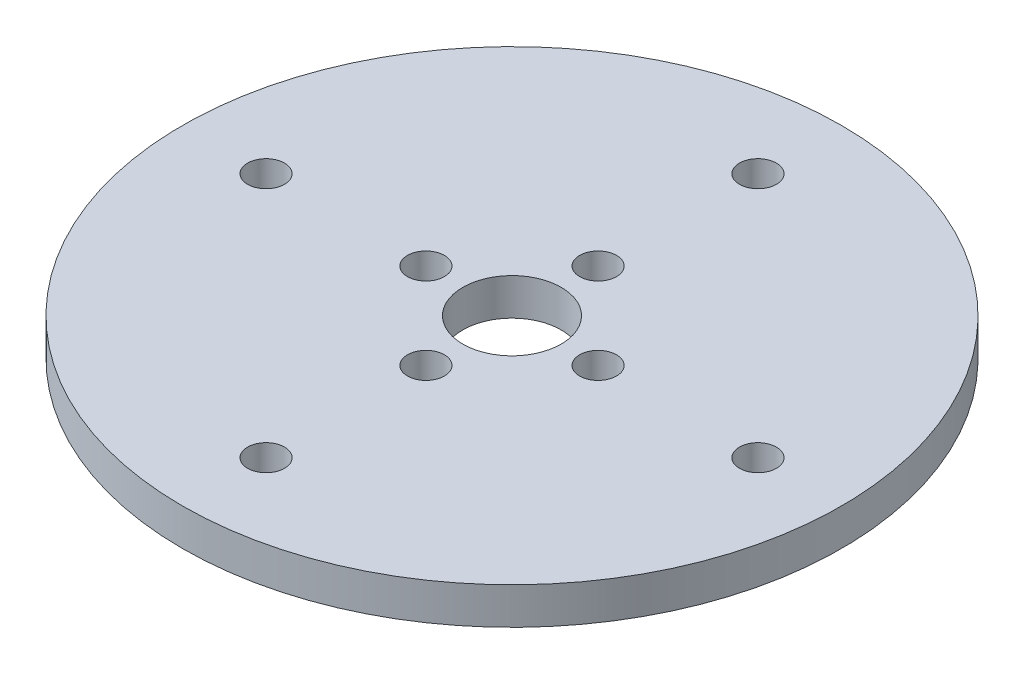
ISO-10303-21;
HEADER;
FILE_DESCRIPTION(('STEP AP214'),'2;1');
FILE_NAME('part.step','',(''),(''),'','','');
FILE_SCHEMA(('AUTOMOTIVE_DESIGN { 1 0 10303 214 1 1 1 1 }'));
ENDSEC;
DATA;
#1=APPLICATION_CONTEXT('core data for automotive mechanical design processes');
#2=APPLICATION_PROTOCOL_DEFINITION('international standard','automotive_design',2000,#1);
#3=PRODUCT_CONTEXT('',#1,'mechanical');
#4=PRODUCT('Part','Part','',(#3));
#5=PRODUCT_RELATED_PRODUCT_CATEGORY('part','',(#4));
#6=PRODUCT_DEFINITION_FORMATION('','',#4);
#7=PRODUCT_DEFINITION_CONTEXT('part definition',#1,'design');
#8=PRODUCT_DEFINITION('design','',#6,#7);
#9=PRODUCT_DEFINITION_SHAPE('','',#8);
#10=(LENGTH_UNIT() NAMED_UNIT(*) SI_UNIT(.MILLI.,.METRE.));
#11=(NAMED_UNIT(*) PLANE_ANGLE_UNIT() SI_UNIT($,.RADIAN.));
#12=(NAMED_UNIT(*) SI_UNIT($,.STERADIAN.) SOLID_ANGLE_UNIT());
#13=UNCERTAINTY_MEASURE_WITH_UNIT(LENGTH_MEASURE(1.E-05),#10,'distance_accuracy_value','');
#14=(GEOMETRIC_REPRESENTATION_CONTEXT(3) GLOBAL_UNCERTAINTY_ASSIGNED_CONTEXT((#13)) GLOBAL_UNIT_ASSIGNED_CONTEXT((#10,
#11,#12)) REPRESENTATION_CONTEXT('',''));
#15=CARTESIAN_POINT('',(0.,0.,0.));
#16=DIRECTION('',(0.,0.,1.));
#17=DIRECTION('',(1.,0.,0.));
#18=AXIS2_PLACEMENT_3D('',#15,#16,#17);
#19=CARTESIAN_POINT('',(0.,3.,0.));
#20=DIRECTION('',(0.,1.,0.));
#21=DIRECTION('',(0.,0.,1.));
#22=AXIS2_PLACEMENT_3D('',#19,#20,#21);
#23=PLANE('',#22);
#24=CARTESIAN_POINT('',(7.,3.,0.));
#25=DIRECTION('',(0.,1.,0.));
#26=DIRECTION('',(0.,0.,1.));
#27=AXIS2_PLACEMENT_3D('',#24,#25,#26);
#28=CIRCLE('',#27,1.5);
#29=CARTESIAN_POINT('',(7.,3.,1.5));
#30=VERTEX_POINT('',#29);
#31=EDGE_CURVE('E104',#30,#30,#28,.T.);
#32=ORIENTED_EDGE('',*,*,#31,.F.);
#33=EDGE_LOOP('',(#32));
#34=FACE_BOUND('',#33,.T.);
#35=CARTESIAN_POINT('',(0.,3.,7.));
#36=DIRECTION('',(0.,1.,0.));
#37=DIRECTION('',(0.,0.,1.));
#38=AXIS2_PLACEMENT_3D('',#35,#36,#37);
#39=CIRCLE('',#38,1.5);
#40=CARTESIAN_POINT('',(0.,3.,8.5));
#41=VERTEX_POINT('',#40);
#42=EDGE_CURVE('E88',#41,#41,#39,.T.);
#43=ORIENTED_EDGE('',*,*,#42,.F.);
#44=EDGE_LOOP('',(#43));
#45=FACE_BOUND('',#44,.T.);
#46=CARTESIAN_POINT('',(-7.,3.,0.));
#47=DIRECTION('',(0.,1.,0.));
#48=DIRECTION('',(0.,0.,1.));
#49=AXIS2_PLACEMENT_3D('',#46,#47,#48);
#50=CIRCLE('',#49,1.5);
#51=CARTESIAN_POINT('',(-7.,3.,1.5));
#52=VERTEX_POINT('',#51);
#53=EDGE_CURVE('E72',#52,#52,#50,.T.);
#54=ORIENTED_EDGE('',*,*,#53,.F.);
#55=EDGE_LOOP('',(#54));
#56=FACE_BOUND('',#55,.T.);
#57=CARTESIAN_POINT('',(0.,3.,-20.));
#58=DIRECTION('',(0.,1.,0.));
#59=DIRECTION('',(0.,0.,1.));
#60=AXIS2_PLACEMENT_3D('',#57,#58,#59);
#61=CIRCLE('',#60,1.5);
#62=CARTESIAN_POINT('',(0.,3.,-18.5));
#63=VERTEX_POINT('',#62);
#64=EDGE_CURVE('E56',#63,#63,#61,.T.);
#65=ORIENTED_EDGE('',*,*,#64,.F.);
#66=EDGE_LOOP('',(#65));
#67=FACE_BOUND('',#66,.T.);
#68=CARTESIAN_POINT('',(0.,3.,0.));
#69=DIRECTION('',(0.,1.,0.));
#70=DIRECTION('',(0.,0.,1.));
#71=AXIS2_PLACEMENT_3D('',#68,#69,#70);
#72=CIRCLE('',#71,26.8);
#73=CARTESIAN_POINT('',(0.,3.,26.8));
#74=VERTEX_POINT('',#73);
#75=EDGE_CURVE('E10',#74,#74,#72,.T.);
#76=ORIENTED_EDGE('',*,*,#75,.T.);
#77=EDGE_LOOP('',(#76));
#78=FACE_BOUND('',#77,.T.);
#79=CARTESIAN_POINT('',(0.,3.,0.));
#80=DIRECTION('',(0.,1.,0.));
#81=DIRECTION('',(0.,0.,1.));
#82=AXIS2_PLACEMENT_3D('',#79,#80,#81);
#83=CIRCLE('',#82,4.);
#84=CARTESIAN_POINT('',(0.,3.,4.));
#85=VERTEX_POINT('',#84);
#86=EDGE_CURVE('E50',#85,#85,#83,.T.);
#87=ORIENTED_EDGE('',*,*,#86,.F.);
#88=EDGE_LOOP('',(#87));
#89=FACE_BOUND('',#88,.T.);
#90=CARTESIAN_POINT('',(-20.,3.,0.));
#91=DIRECTION('',(0.,1.,0.));
#92=DIRECTION('',(0.,0.,1.));
#93=AXIS2_PLACEMENT_3D('',#90,#91,#92);
#94=CIRCLE('',#93,1.5);
#95=CARTESIAN_POINT('',(-20.,3.,1.5));
#96=VERTEX_POINT('',#95);
#97=EDGE_CURVE('E64',#96,#96,#94,.T.);
#98=ORIENTED_EDGE('',*,*,#97,.F.);
#99=EDGE_LOOP('',(#98));
#100=FACE_BOUND('',#99,.T.);
#101=CARTESIAN_POINT('',(0.,3.,-7.));
#102=DIRECTION('',(0.,1.,0.));
#103=DIRECTION('',(0.,0.,1.));
#104=AXIS2_PLACEMENT_3D('',#101,#102,#103);
#105=CIRCLE('',#104,1.5);
#106=CARTESIAN_POINT('',(0.,3.,-5.5));
#107=VERTEX_POINT('',#106);
#108=EDGE_CURVE('E80',#107,#107,#105,.T.);
#109=ORIENTED_EDGE('',*,*,#108,.F.);
#110=EDGE_LOOP('',(#109));
#111=FACE_BOUND('',#110,.T.);
#112=CARTESIAN_POINT('',(0.,3.,20.));
#113=DIRECTION('',(0.,1.,0.));
#114=DIRECTION('',(0.,0.,1.));
#115=AXIS2_PLACEMENT_3D('',#112,#113,#114);
#116=CIRCLE('',#115,1.5);
#117=CARTESIAN_POINT('',(0.,3.,21.5));
#118=VERTEX_POINT('',#117);
#119=EDGE_CURVE('E96',#118,#118,#116,.T.);
#120=ORIENTED_EDGE('',*,*,#119,.F.);
#121=EDGE_LOOP('',(#120));
#122=FACE_BOUND('',#121,.T.);
#123=CARTESIAN_POINT('',(20.,3.,0.));
#124=DIRECTION('',(0.,1.,0.));
#125=DIRECTION('',(0.,0.,1.));
#126=AXIS2_PLACEMENT_3D('',#123,#124,#125);
#127=CIRCLE('',#126,1.5);
#128=CARTESIAN_POINT('',(20.,3.,1.5));
#129=VERTEX_POINT('',#128);
#130=EDGE_CURVE('E112',#129,#129,#127,.T.);
#131=ORIENTED_EDGE('',*,*,#130,.F.);
#132=EDGE_LOOP('',(#131));
#133=FACE_BOUND('',#132,.T.);
#134=ADVANCED_FACE('F37',(#34,#45,#56,#67,#78,#89,#100,#111,#122,#133),#23,.T.);
#135=CARTESIAN_POINT('',(0.,0.,0.));
#136=DIRECTION('',(0.,1.,0.));
#137=DIRECTION('',(0.,0.,1.));
#138=AXIS2_PLACEMENT_3D('',#135,#136,#137);
#139=PLANE('',#138);
#140=CARTESIAN_POINT('',(0.,0.,0.));
#141=DIRECTION('',(0.,1.,0.));
#142=DIRECTION('',(0.,0.,1.));
#143=AXIS2_PLACEMENT_3D('',#140,#141,#142);
#144=CIRCLE('',#143,26.8);
#145=CARTESIAN_POINT('',(0.,0.,26.8));
#146=VERTEX_POINT('',#145);
#147=EDGE_CURVE('E41',#146,#146,#144,.T.);
#148=ORIENTED_EDGE('',*,*,#147,.F.);
#149=EDGE_LOOP('',(#148));
#150=FACE_BOUND('',#149,.T.);
#151=CARTESIAN_POINT('',(0.,0.,0.));
#152=DIRECTION('',(0.,1.,0.));
#153=DIRECTION('',(0.,0.,1.));
#154=AXIS2_PLACEMENT_3D('',#151,#152,#153);
#155=CIRCLE('',#154,4.);
#156=CARTESIAN_POINT('',(0.,0.,4.));
#157=VERTEX_POINT('',#156);
#158=EDGE_CURVE('E52',#157,#157,#155,.T.);
#159=ORIENTED_EDGE('',*,*,#158,.T.);
#160=EDGE_LOOP('',(#159));
#161=FACE_BOUND('',#160,.T.);
#162=CARTESIAN_POINT('',(0.,0.,-20.));
#163=DIRECTION('',(0.,1.,0.));
#164=DIRECTION('',(0.,0.,1.));
#165=AXIS2_PLACEMENT_3D('',#162,#163,#164);
#166=CIRCLE('',#165,1.5);
#167=CARTESIAN_POINT('',(0.,0.,-18.5));
#168=VERTEX_POINT('',#167);
#169=EDGE_CURVE('E60',#168,#168,#166,.T.);
#170=ORIENTED_EDGE('',*,*,#169,.T.);
#171=EDGE_LOOP('',(#170));
#172=FACE_BOUND('',#171,.T.);
#173=CARTESIAN_POINT('',(-20.,0.,0.));
#174=DIRECTION('',(0.,1.,0.));
#175=DIRECTION('',(0.,0.,1.));
#176=AXIS2_PLACEMENT_3D('',#173,#174,#175);
#177=CIRCLE('',#176,1.5);
#178=CARTESIAN_POINT('',(-20.,0.,1.5));
#179=VERTEX_POINT('',#178);
#180=EDGE_CURVE('E68',#179,#179,#177,.T.);
#181=ORIENTED_EDGE('',*,*,#180,.T.);
#182=EDGE_LOOP('',(#181));
#183=FACE_BOUND('',#182,.T.);
#184=CARTESIAN_POINT('',(-7.,0.,0.));
#185=DIRECTION('',(0.,1.,0.));
#186=DIRECTION('',(0.,0.,1.));
#187=AXIS2_PLACEMENT_3D('',#184,#185,#186);
#188=CIRCLE('',#187,1.5);
#189=CARTESIAN_POINT('',(-7.,0.,1.5));
#190=VERTEX_POINT('',#189);
#191=EDGE_CURVE('E76',#190,#190,#188,.T.);
#192=ORIENTED_EDGE('',*,*,#191,.T.);
#193=EDGE_LOOP('',(#192));
#194=FACE_BOUND('',#193,.T.);
#195=CARTESIAN_POINT('',(0.,0.,-7.));
#196=DIRECTION('',(0.,1.,0.));
#197=DIRECTION('',(0.,0.,1.));
#198=AXIS2_PLACEMENT_3D('',#195,#196,#197);
#199=CIRCLE('',#198,1.5);
#200=CARTESIAN_POINT('',(0.,0.,-5.5));
#201=VERTEX_POINT('',#200);
#202=EDGE_CURVE('E84',#201,#201,#199,.T.);
#203=ORIENTED_EDGE('',*,*,#202,.T.);
#204=EDGE_LOOP('',(#203));
#205=FACE_BOUND('',#204,.T.);
#206=CARTESIAN_POINT('',(0.,0.,7.));
#207=DIRECTION('',(0.,1.,0.));
#208=DIRECTION('',(0.,0.,1.));
#209=AXIS2_PLACEMENT_3D('',#206,#207,#208);
#210=CIRCLE('',#209,1.5);
#211=CARTESIAN_POINT('',(0.,0.,8.5));
#212=VERTEX_POINT('',#211);
#213=EDGE_CURVE('E92',#212,#212,#210,.T.);
#214=ORIENTED_EDGE('',*,*,#213,.T.);
#215=EDGE_LOOP('',(#214));
#216=FACE_BOUND('',#215,.T.);
#217=CARTESIAN_POINT('',(0.,0.,20.));
#218=DIRECTION('',(0.,1.,0.));
#219=DIRECTION('',(0.,0.,1.));
#220=AXIS2_PLACEMENT_3D('',#217,#218,#219);
#221=CIRCLE('',#220,1.5);
#222=CARTESIAN_POINT('',(0.,0.,21.5));
#223=VERTEX_POINT('',#222);
#224=EDGE_CURVE('E100',#223,#223,#221,.T.);
#225=ORIENTED_EDGE('',*,*,#224,.T.);
#226=EDGE_LOOP('',(#225));
#227=FACE_BOUND('',#226,.T.);
#228=CARTESIAN_POINT('',(7.,0.,0.));
#229=DIRECTION('',(0.,1.,0.));
#230=DIRECTION('',(0.,0.,1.));
#231=AXIS2_PLACEMENT_3D('',#228,#229,#230);
#232=CIRCLE('',#231,1.5);
#233=CARTESIAN_POINT('',(7.,0.,1.5));
#234=VERTEX_POINT('',#233);
#235=EDGE_CURVE('E108',#234,#234,#232,.T.);
#236=ORIENTED_EDGE('',*,*,#235,.T.);
#237=EDGE_LOOP('',(#236));
#238=FACE_BOUND('',#237,.T.);
#239=CARTESIAN_POINT('',(20.,0.,0.));
#240=DIRECTION('',(0.,1.,0.));
#241=DIRECTION('',(0.,0.,1.));
#242=AXIS2_PLACEMENT_3D('',#239,#240,#241);
#243=CIRCLE('',#242,1.5);
#244=CARTESIAN_POINT('',(20.,0.,1.5));
#245=VERTEX_POINT('',#244);
#246=EDGE_CURVE('E116',#245,#245,#243,.T.);
#247=ORIENTED_EDGE('',*,*,#246,.T.);
#248=EDGE_LOOP('',(#247));
#249=FACE_BOUND('',#248,.T.);
#250=ADVANCED_FACE('F128',(#150,#161,#172,#183,#194,#205,#216,#227,#238,#249),#139,.F.);
#251=CARTESIAN_POINT('',(0.,3.,0.));
#252=DIRECTION('',(0.,-1.,0.));
#253=DIRECTION('',(0.,0.,-1.));
#254=AXIS2_PLACEMENT_3D('',#251,#252,#253);
#255=CYLINDRICAL_SURFACE('',#254,26.8);
#256=ORIENTED_EDGE('',*,*,#75,.F.);
#257=EDGE_LOOP('',(#256));
#258=FACE_BOUND('',#257,.T.);
#259=ORIENTED_EDGE('',*,*,#147,.T.);
#260=EDGE_LOOP('',(#259));
#261=FACE_BOUND('',#260,.T.);
#262=ADVANCED_FACE('F39',(#258,#261),#255,.T.);
#263=CARTESIAN_POINT('',(0.,3.,0.));
#264=DIRECTION('',(0.,-1.,0.));
#265=DIRECTION('',(0.,0.,-1.));
#266=AXIS2_PLACEMENT_3D('',#263,#264,#265);
#267=CYLINDRICAL_SURFACE('',#266,4.);
#268=ORIENTED_EDGE('',*,*,#86,.T.);
#269=EDGE_LOOP('',(#268));
#270=FACE_BOUND('',#269,.T.);
#271=ORIENTED_EDGE('',*,*,#158,.F.);
#272=EDGE_LOOP('',(#271));
#273=FACE_BOUND('',#272,.T.);
#274=ADVANCED_FACE('F138',(#270,#273),#267,.F.);
#275=CARTESIAN_POINT('',(0.,3.,-20.));
#276=DIRECTION('',(0.,-1.,0.));
#277=DIRECTION('',(0.,0.,-1.));
#278=AXIS2_PLACEMENT_3D('',#275,#276,#277);
#279=CYLINDRICAL_SURFACE('',#278,1.5);
#280=ORIENTED_EDGE('',*,*,#64,.T.);
#281=EDGE_LOOP('',(#280));
#282=FACE_BOUND('',#281,.T.);
#283=ORIENTED_EDGE('',*,*,#169,.F.);
#284=EDGE_LOOP('',(#283));
#285=FACE_BOUND('',#284,.T.);
#286=ADVANCED_FACE('F141',(#282,#285),#279,.F.);
#287=CARTESIAN_POINT('',(-20.,3.,0.));
#288=DIRECTION('',(0.,-1.,0.));
#289=DIRECTION('',(0.,0.,-1.));
#290=AXIS2_PLACEMENT_3D('',#287,#288,#289);
#291=CYLINDRICAL_SURFACE('',#290,1.5);
#292=ORIENTED_EDGE('',*,*,#97,.T.);
#293=EDGE_LOOP('',(#292));
#294=FACE_BOUND('',#293,.T.);
#295=ORIENTED_EDGE('',*,*,#180,.F.);
#296=EDGE_LOOP('',(#295));
#297=FACE_BOUND('',#296,.T.);
#298=ADVANCED_FACE('F145',(#294,#297),#291,.F.);
#299=CARTESIAN_POINT('',(-7.,3.,0.));
#300=DIRECTION('',(0.,-1.,0.));
#301=DIRECTION('',(0.,0.,-1.));
#302=AXIS2_PLACEMENT_3D('',#299,#300,#301);
#303=CYLINDRICAL_SURFACE('',#302,1.5);
#304=ORIENTED_EDGE('',*,*,#53,.T.);
#305=EDGE_LOOP('',(#304));
#306=FACE_BOUND('',#305,.T.);
#307=ORIENTED_EDGE('',*,*,#191,.F.);
#308=EDGE_LOOP('',(#307));
#309=FACE_BOUND('',#308,.T.);
#310=ADVANCED_FACE('F149',(#306,#309),#303,.F.);
#311=CARTESIAN_POINT('',(0.,3.,-7.));
#312=DIRECTION('',(0.,-1.,0.));
#313=DIRECTION('',(0.,0.,-1.));
#314=AXIS2_PLACEMENT_3D('',#311,#312,#313);
#315=CYLINDRICAL_SURFACE('',#314,1.5);
#316=ORIENTED_EDGE('',*,*,#108,.T.);
#317=EDGE_LOOP('',(#316));
#318=FACE_BOUND('',#317,.T.);
#319=ORIENTED_EDGE('',*,*,#202,.F.);
#320=EDGE_LOOP('',(#319));
#321=FACE_BOUND('',#320,.T.);
#322=ADVANCED_FACE('F153',(#318,#321),#315,.F.);
#323=CARTESIAN_POINT('',(0.,3.,7.));
#324=DIRECTION('',(0.,-1.,0.));
#325=DIRECTION('',(0.,0.,-1.));
#326=AXIS2_PLACEMENT_3D('',#323,#324,#325);
#327=CYLINDRICAL_SURFACE('',#326,1.5);
#328=ORIENTED_EDGE('',*,*,#42,.T.);
#329=EDGE_LOOP('',(#328));
#330=FACE_BOUND('',#329,.T.);
#331=ORIENTED_EDGE('',*,*,#213,.F.);
#332=EDGE_LOOP('',(#331));
#333=FACE_BOUND('',#332,.T.);
#334=ADVANCED_FACE('F157',(#330,#333),#327,.F.);
#335=CARTESIAN_POINT('',(0.,3.,20.));
#336=DIRECTION('',(0.,-1.,0.));
#337=DIRECTION('',(0.,0.,-1.));
#338=AXIS2_PLACEMENT_3D('',#335,#336,#337);
#339=CYLINDRICAL_SURFACE('',#338,1.5);
#340=ORIENTED_EDGE('',*,*,#119,.T.);
#341=EDGE_LOOP('',(#340));
#342=FACE_BOUND('',#341,.T.);
#343=ORIENTED_EDGE('',*,*,#224,.F.);
#344=EDGE_LOOP('',(#343));
#345=FACE_BOUND('',#344,.T.);
#346=ADVANCED_FACE('F161',(#342,#345),#339,.F.);
#347=CARTESIAN_POINT('',(7.,3.,0.));
#348=DIRECTION('',(0.,-1.,0.));
#349=DIRECTION('',(0.,0.,-1.));
#350=AXIS2_PLACEMENT_3D('',#347,#348,#349);
#351=CYLINDRICAL_SURFACE('',#350,1.5);
#352=ORIENTED_EDGE('',*,*,#31,.T.);
#353=EDGE_LOOP('',(#352));
#354=FACE_BOUND('',#353,.T.);
#355=ORIENTED_EDGE('',*,*,#235,.F.);
#356=EDGE_LOOP('',(#355));
#357=FACE_BOUND('',#356,.T.);
#358=ADVANCED_FACE('F165',(#354,#357),#351,.F.);
#359=CARTESIAN_POINT('',(20.,3.,0.));
#360=DIRECTION('',(0.,-1.,0.));
#361=DIRECTION('',(0.,0.,-1.));
#362=AXIS2_PLACEMENT_3D('',#359,#360,#361);
#363=CYLINDRICAL_SURFACE('',#362,1.5);
#364=ORIENTED_EDGE('',*,*,#130,.T.);
#365=EDGE_LOOP('',(#364));
#366=FACE_BOUND('',#365,.T.);
#367=ORIENTED_EDGE('',*,*,#246,.F.);
#368=EDGE_LOOP('',(#367));
#369=FACE_BOUND('',#368,.T.);
#370=ADVANCED_FACE('F124',(#366,#369),#363,.F.);
#371=CLOSED_SHELL('',(#134,#250,#262,#274,#286,#298,#310,#322,#334,#346,#358,#370));
#372=MANIFOLD_SOLID_BREP('B2',#371);
#373=ADVANCED_BREP_SHAPE_REPRESENTATION('',(#18,#372),#14);
#374=SHAPE_DEFINITION_REPRESENTATION(#9,#373);
ENDSEC;
END-ISO-10303-21;
